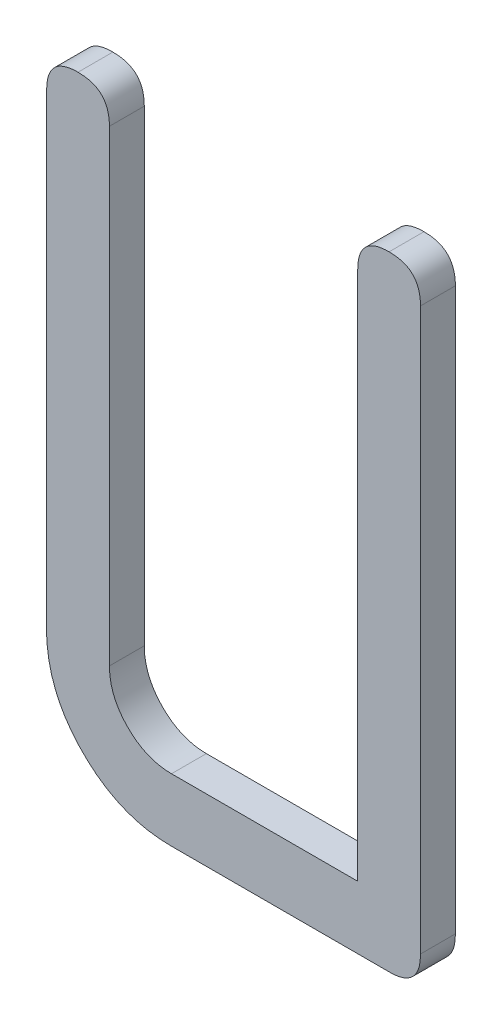
ISO-10303-21;
HEADER;
FILE_DESCRIPTION(('STEP AP214'),'2;1');
FILE_NAME('part.step','',(''),(''),'','','');
FILE_SCHEMA(('AUTOMOTIVE_DESIGN { 1 0 10303 214 1 1 1 1 }'));
ENDSEC;
DATA;
#1=APPLICATION_CONTEXT('core data for automotive mechanical design processes');
#2=APPLICATION_PROTOCOL_DEFINITION('international standard','automotive_design',2000,#1);
#3=PRODUCT_CONTEXT('',#1,'mechanical');
#4=PRODUCT('Part','Part','',(#3));
#5=PRODUCT_RELATED_PRODUCT_CATEGORY('part','',(#4));
#6=PRODUCT_DEFINITION_FORMATION('','',#4);
#7=PRODUCT_DEFINITION_CONTEXT('part definition',#1,'design');
#8=PRODUCT_DEFINITION('design','',#6,#7);
#9=PRODUCT_DEFINITION_SHAPE('','',#8);
#10=(LENGTH_UNIT() NAMED_UNIT(*) SI_UNIT(.MILLI.,.METRE.));
#11=(NAMED_UNIT(*) PLANE_ANGLE_UNIT() SI_UNIT($,.RADIAN.));
#12=(NAMED_UNIT(*) SI_UNIT($,.STERADIAN.) SOLID_ANGLE_UNIT());
#13=UNCERTAINTY_MEASURE_WITH_UNIT(LENGTH_MEASURE(1.E-05),#10,'distance_accuracy_value','');
#14=(GEOMETRIC_REPRESENTATION_CONTEXT(3) GLOBAL_UNCERTAINTY_ASSIGNED_CONTEXT((#13)) GLOBAL_UNIT_ASSIGNED_CONTEXT((#10,
#11,#12)) REPRESENTATION_CONTEXT('',''));
#15=CARTESIAN_POINT('',(0.,0.,0.));
#16=DIRECTION('',(0.,0.,1.));
#17=DIRECTION('',(1.,0.,0.));
#18=AXIS2_PLACEMENT_3D('',#15,#16,#17);
#19=CARTESIAN_POINT('',(0.,0.,1.6));
#20=DIRECTION('',(0.,0.,-1.));
#21=DIRECTION('',(-1.,0.,0.));
#22=AXIS2_PLACEMENT_3D('',#19,#20,#21);
#23=PLANE('',#22);
#24=CARTESIAN_POINT('',(5.0490562474728,-20.3746172798276,1.6));
#25=CARTESIAN_POINT('',(5.0490562474728,-20.2853047798276,1.6));
#26=CARTESIAN_POINT('',(5.1390562474728,-20.2853047798276,1.6));
#27=B_SPLINE_CURVE_WITH_KNOTS('',2,(#24,#25,#26),.UNSPECIFIED.,.F.,.F.,(3,3),(0.,1.),.UNSPECIFIED.);
#28=CARTESIAN_POINT('',(5.0490562474728,-20.3746172798276,1.6));
#29=VERTEX_POINT('',#28);
#30=CARTESIAN_POINT('',(5.1390562474728,-20.2853047798276,1.6));
#31=VERTEX_POINT('',#30);
#32=EDGE_CURVE('E167',#29,#31,#27,.T.);
#33=ORIENTED_EDGE('',*,*,#32,.T.);
#34=CARTESIAN_POINT('',(5.1390562474728,-20.2853047798276,1.6));
#35=CARTESIAN_POINT('',(5.2290562474728,-20.2853047798276,1.6));
#36=CARTESIAN_POINT('',(5.2290562474728,-20.3746797798276,1.6));
#37=B_SPLINE_CURVE_WITH_KNOTS('',2,(#34,#35,#36),.UNSPECIFIED.,.F.,.F.,(3,3),(0.,1.),.UNSPECIFIED.);
#38=CARTESIAN_POINT('',(5.2290562474728,-20.3746797798276,1.6));
#39=VERTEX_POINT('',#38);
#40=EDGE_CURVE('E131',#31,#39,#37,.T.);
#41=ORIENTED_EDGE('',*,*,#40,.T.);
#42=DIRECTION('',(0.,1.,0.));
#43=VECTOR('',#42,1.);
#44=CARTESIAN_POINT('',(5.2290562474728,-20.3746797798276,1.6));
#45=LINE('',#44,#43);
#46=CARTESIAN_POINT('',(5.2290562474728,-21.9839297798276,1.6));
#47=VERTEX_POINT('',#46);
#48=EDGE_CURVE('E126',#47,#39,#45,.T.);
#49=ORIENTED_EDGE('',*,*,#48,.F.);
#50=CARTESIAN_POINT('',(5.2290562474728,-21.9839297798276,1.6));
#51=CARTESIAN_POINT('',(5.2290562474728,-22.0733047798276,1.6));
#52=CARTESIAN_POINT('',(5.1397437474728,-22.0733047798276,1.6));
#53=B_SPLINE_CURVE_WITH_KNOTS('',2,(#50,#51,#52),.UNSPECIFIED.,.F.,.F.,(3,3),(0.,1.),.UNSPECIFIED.);
#54=CARTESIAN_POINT('',(5.1397437474728,-22.0733047798276,1.6));
#55=VERTEX_POINT('',#54);
#56=EDGE_CURVE('E115',#47,#55,#53,.T.);
#57=ORIENTED_EDGE('',*,*,#56,.T.);
#58=DIRECTION('',(1.,0.,0.));
#59=VECTOR('',#58,1.);
#60=CARTESIAN_POINT('',(5.1397437474728,-22.0733047798276,1.6));
#61=LINE('',#60,#59);
#62=CARTESIAN_POINT('',(4.5143687474728,-22.0733047798276,1.6));
#63=VERTEX_POINT('',#62);
#64=EDGE_CURVE('E123',#63,#55,#61,.T.);
#65=ORIENTED_EDGE('',*,*,#64,.F.);
#66=CARTESIAN_POINT('',(4.5143687474728,-22.0733047798276,1.6));
#67=CARTESIAN_POINT('',(4.50393603895574,-22.073304754124,1.6));
#68=CARTESIAN_POINT('',(4.49350386209723,-22.0729154749746,1.6));
#69=CARTESIAN_POINT('',(4.472695054846,-22.0712921820855,1.6));
#70=CARTESIAN_POINT('',(4.46231849664316,-22.070057256145,1.6));
#71=CARTESIAN_POINT('',(4.43155614728114,-22.0650131629388,1.6));
#72=CARTESIAN_POINT('',(4.41136532856191,-22.0598667097274,1.6));
#73=CARTESIAN_POINT('',(4.37258794329084,-22.0459610773158,1.6));
#74=CARTESIAN_POINT('',(4.35398314812924,-22.0372525012637,1.6));
#75=CARTESIAN_POINT('',(4.31863280545991,-22.0165900034179,1.6));
#76=CARTESIAN_POINT('',(4.30189080265436,-22.0046300385335,1.6));
#77=CARTESIAN_POINT('',(4.27889005754236,-21.985203781461,1.6));
#78=CARTESIAN_POINT('',(4.27177587829491,-21.9787129878903,1.6));
#79=CARTESIAN_POINT('',(4.25801399862505,-21.9652541426843,1.6));
#80=CARTESIAN_POINT('',(4.25136629036991,-21.9582860990667,1.6));
#81=CARTESIAN_POINT('',(4.23223778448844,-21.9366846074464,1.6));
#82=CARTESIAN_POINT('',(4.22054540978263,-21.9213318030311,1.6));
#83=CARTESIAN_POINT('',(4.19863866809116,-21.8868927684254,1.6));
#84=CARTESIAN_POINT('',(4.18877631776532,-21.8675795690674,1.6));
#85=CARTESIAN_POINT('',(4.17303460967354,-21.8273811732028,1.6));
#86=CARTESIAN_POINT('',(4.16715638416496,-21.8064955316924,1.6));
#87=CARTESIAN_POINT('',(4.16111567985639,-21.7737918216992,1.6));
#88=CARTESIAN_POINT('',(4.15956832774919,-21.7622049599132,1.6));
#89=CARTESIAN_POINT('',(4.15753973602336,-21.7389712730455,1.6));
#90=CARTESIAN_POINT('',(4.15705536680045,-21.7273247254521,1.6));
#91=CARTESIAN_POINT('',(4.1570562474728,-21.7156797798276,1.6));
#92=B_SPLINE_CURVE_WITH_KNOTS('',3,(#66,#67,#68,#69,#70,#71,#72,#73,#74,#75,#76,#77,#78,#79,#80,
#81,#82,#83,#84,#85,#86,#87,#88,#89,#90,#91),.UNSPECIFIED.,.F.,.F.,(4,2,2,2,2,2,2,2,2,2,2,2,4),
(0.,0.0312867126848692,0.062607227678475,0.124737780063914,0.186014779363176,0.247406457190195,
0.276278624651331,0.305150307190951,0.362792001355015,0.427434931974207,0.492096225918407,
0.527122745388371,0.562046001633574),.UNSPECIFIED.);
#93=CARTESIAN_POINT('',(4.1570562474728,-21.7156797798276,1.6));
#94=VERTEX_POINT('',#93);
#95=EDGE_CURVE('E23',#63,#94,#92,.T.);
#96=ORIENTED_EDGE('',*,*,#95,.T.);
#97=DIRECTION('',(0.,1.,0.));
#98=VECTOR('',#97,1.);
#99=CARTESIAN_POINT('',(4.1570562474728,-21.7156797798276,1.6));
#100=LINE('',#99,#98);
#101=CARTESIAN_POINT('',(4.1570562474728,-20.3746797798276,1.6));
#102=VERTEX_POINT('',#101);
#103=EDGE_CURVE('E289',#102,#94,#100,.F.);
#104=ORIENTED_EDGE('',*,*,#103,.F.);
#105=CARTESIAN_POINT('',(4.1570562474728,-20.3746797798276,1.6));
#106=CARTESIAN_POINT('',(4.1570562474728,-20.2853047798276,1.6));
#107=CARTESIAN_POINT('',(4.2470562474728,-20.2853047798276,1.6));
#108=B_SPLINE_CURVE_WITH_KNOTS('',2,(#105,#106,#107),.UNSPECIFIED.,.F.,.F.,(3,3),(0.,1.),.UNSPECIFIED.);
#109=CARTESIAN_POINT('',(4.2470562474728,-20.2853047798276,1.6));
#110=VERTEX_POINT('',#109);
#111=EDGE_CURVE('E140',#102,#110,#108,.T.);
#112=ORIENTED_EDGE('',*,*,#111,.T.);
#113=CARTESIAN_POINT('',(4.2470562474728,-20.2853047798276,1.6));
#114=CARTESIAN_POINT('',(4.3370562474728,-20.2853047798276,1.6));
#115=CARTESIAN_POINT('',(4.3370562474728,-20.3746172798276,1.6));
#116=B_SPLINE_CURVE_WITH_KNOTS('',2,(#113,#114,#115),.UNSPECIFIED.,.F.,.F.,(3,3),(0.,1.),.UNSPECIFIED.);
#117=CARTESIAN_POINT('',(4.3370562474728,-20.3746172798276,1.6));
#118=VERTEX_POINT('',#117);
#119=EDGE_CURVE('E165',#110,#118,#116,.T.);
#120=ORIENTED_EDGE('',*,*,#119,.T.);
#121=DIRECTION('',(0.,1.,0.));
#122=VECTOR('',#121,1.);
#123=CARTESIAN_POINT('',(4.3370562474728,-20.3746172798276,1.6));
#124=LINE('',#123,#122);
#125=CARTESIAN_POINT('',(4.3370562474728,-21.7146172798276,1.6));
#126=VERTEX_POINT('',#125);
#127=EDGE_CURVE('E281',#126,#118,#124,.T.);
#128=ORIENTED_EDGE('',*,*,#127,.F.);
#129=CARTESIAN_POINT('',(4.3370562474728,-21.7146172798276,1.6));
#130=CARTESIAN_POINT('',(4.33704374375032,-21.7230571255512,1.6));
#131=CARTESIAN_POINT('',(4.3375783012639,-21.7315111779369,1.6));
#132=CARTESIAN_POINT('',(4.33981596617988,-21.7482397337702,1.6));
#133=CARTESIAN_POINT('',(4.34151621745391,-21.756514625184,1.6));
#134=CARTESIAN_POINT('',(4.34665663870329,-21.7744573287166,1.6));
#135=CARTESIAN_POINT('',(4.3503917142759,-21.7840433588827,1.6));
#136=CARTESIAN_POINT('',(4.35956572059307,-21.8023666239929,1.6));
#137=CARTESIAN_POINT('',(4.36500657707079,-21.8111028849159,1.6));
#138=CARTESIAN_POINT('',(4.37680816243496,-21.8269306761822,1.6));
#139=CARTESIAN_POINT('',(4.38307222513936,-21.8340958276667,1.6));
#140=CARTESIAN_POINT('',(4.39649605824151,-21.8475332293022,1.6));
#141=CARTESIAN_POINT('',(4.40365602035466,-21.8538052877224,1.6));
#142=CARTESIAN_POINT('',(4.42022465453052,-21.8661659979595,1.6));
#143=CARTESIAN_POINT('',(4.42980728590008,-21.8720278527775,1.6));
#144=CARTESIAN_POINT('',(4.44996405310579,-21.8816704557201,1.6));
#145=CARTESIAN_POINT('',(4.46053695087667,-21.8854537629161,1.6));
#146=CARTESIAN_POINT('',(4.4785021736995,-21.8899098976345,1.6));
#147=CARTESIAN_POINT('',(4.48574940480107,-21.89120350382,1.6));
#148=CARTESIAN_POINT('',(4.50035195843826,-21.8929036998722,1.6));
#149=CARTESIAN_POINT('',(4.50770732640855,-21.893309905507,1.6));
#150=CARTESIAN_POINT('',(4.5150562474728,-21.8933047798276,1.6));
#151=B_SPLINE_CURVE_WITH_KNOTS('',3,(#129,#130,#131,#132,#133,#134,#135,#136,#137,#138,#139,
#140,#141,#142,#143,#144,#145,#146,#147,#148,#149,#150),.UNSPECIFIED.,.F.,.F.,(4,2,2,2,2,2,2,2,
2,2,4),(0.,0.0253217096994885,0.0505815980153853,0.0812577834004923,0.11196872598776,
0.140428441846121,0.168894258308297,0.202372845262285,0.23581012106628,0.257843277302252,
0.279885971697863),.UNSPECIFIED.);
#152=CARTESIAN_POINT('',(4.5150562474728,-21.8933047798276,1.6));
#153=VERTEX_POINT('',#152);
#154=EDGE_CURVE('E169',#126,#153,#151,.T.);
#155=ORIENTED_EDGE('',*,*,#154,.T.);
#156=DIRECTION('',(1.,0.,0.));
#157=VECTOR('',#156,1.);
#158=CARTESIAN_POINT('',(4.5150562474728,-21.8933047798276,1.6));
#159=LINE('',#158,#157);
#160=CARTESIAN_POINT('',(5.0490562474728,-21.8933047798276,1.6));
#161=VERTEX_POINT('',#160);
#162=EDGE_CURVE('E176',#161,#153,#159,.F.);
#163=ORIENTED_EDGE('',*,*,#162,.F.);
#164=DIRECTION('',(0.,1.,0.));
#165=VECTOR('',#164,1.);
#166=CARTESIAN_POINT('',(5.0490562474728,-21.8933047798276,1.6));
#167=LINE('',#166,#165);
#168=EDGE_CURVE('E272',#29,#161,#167,.F.);
#169=ORIENTED_EDGE('',*,*,#168,.F.);
#170=EDGE_LOOP('',(#33,#41,#49,#57,#65,#96,#104,#112,#120,#128,#155,#163,#169));
#171=FACE_BOUND('',#170,.T.);
#172=ADVANCED_FACE('F17',(#171),#23,.T.);
#173=CARTESIAN_POINT('',(5.2290562474728,-21.9839297798276,1.7));
#174=CARTESIAN_POINT('',(5.2290562474728,-22.0733047798276,1.7));
#175=CARTESIAN_POINT('',(5.1397437474728,-22.0733047798276,1.7));
#176=CARTESIAN_POINT('',(5.2290562474728,-21.9839297798276,1.6));
#177=CARTESIAN_POINT('',(5.2290562474728,-22.0733047798276,1.6));
#178=CARTESIAN_POINT('',(5.1397437474728,-22.0733047798276,1.6));
#179=B_SPLINE_SURFACE_WITH_KNOTS('',1,2,((#173,#174,#175),(#176,#177,#178)),.UNSPECIFIED.,.F.,
.F.,.F.,(2,2),(3,3),(0.,1.),(0.,1.),.UNSPECIFIED.);
#180=DIRECTION('',(0.,0.,-1.));
#181=VECTOR('',#180,1.);
#182=CARTESIAN_POINT('',(5.2290562474728,-21.9839297798276,1.7));
#183=LINE('',#182,#181);
#184=CARTESIAN_POINT('',(5.2290562474728,-21.9839297798276,1.7));
#185=VERTEX_POINT('',#184);
#186=EDGE_CURVE('E119',#185,#47,#183,.T.);
#187=CARTESIAN_POINT('',(5.2290562474728,-21.9839297798276,1.7));
#188=CARTESIAN_POINT('',(5.2290562474728,-22.0733047798276,1.7));
#189=CARTESIAN_POINT('',(5.1397437474728,-22.0733047798276,1.7));
#190=B_SPLINE_CURVE_WITH_KNOTS('',2,(#187,#188,#189),.UNSPECIFIED.,.F.,.F.,(3,3),(0.,1.),.UNSPECIFIED.);
#191=CARTESIAN_POINT('',(5.1397437474728,-22.0733047798276,1.7));
#192=VERTEX_POINT('',#191);
#193=EDGE_CURVE('E128',#185,#192,#190,.T.);
#194=DIRECTION('',(0.,0.,-1.));
#195=VECTOR('',#194,1.);
#196=CARTESIAN_POINT('',(5.1397437474728,-22.0733047798276,1.7));
#197=LINE('',#196,#195);
#198=EDGE_CURVE('E120',#55,#192,#197,.F.);
#199=ORIENTED_EDGE('',*,*,#186,.F.);
#200=ORIENTED_EDGE('',*,*,#193,.T.);
#201=ORIENTED_EDGE('',*,*,#198,.F.);
#202=ORIENTED_EDGE('',*,*,#56,.F.);
#203=EDGE_LOOP('',(#199,#200,#201,#202));
#204=FACE_BOUND('',#203,.T.);
#205=ADVANCED_FACE('F117',(#204),#179,.F.);
#206=CARTESIAN_POINT('',(5.1397437474728,-22.0733047798276,1.7));
#207=DIRECTION('',(0.,-1.,0.));
#208=DIRECTION('',(0.,0.,-1.));
#209=AXIS2_PLACEMENT_3D('',#206,#207,#208);
#210=PLANE('',#209);
#211=DIRECTION('',(-1.,0.,0.));
#212=VECTOR('',#211,1.);
#213=CARTESIAN_POINT('',(0.,-22.0733047798276,1.7));
#214=LINE('',#213,#212);
#215=CARTESIAN_POINT('',(4.5143687474728,-22.0733047798276,1.7));
#216=VERTEX_POINT('',#215);
#217=EDGE_CURVE('E261',#192,#216,#214,.T.);
#218=ORIENTED_EDGE('',*,*,#217,.T.);
#219=DIRECTION('',(0.,0.,-1.));
#220=VECTOR('',#219,1.);
#221=CARTESIAN_POINT('',(4.5143687474728,-22.0733047798276,1.65));
#222=LINE('',#221,#220);
#223=EDGE_CURVE('E290',#216,#63,#222,.T.);
#224=ORIENTED_EDGE('',*,*,#223,.T.);
#225=ORIENTED_EDGE('',*,*,#64,.T.);
#226=ORIENTED_EDGE('',*,*,#198,.T.);
#227=EDGE_LOOP('',(#218,#224,#225,#226));
#228=FACE_BOUND('',#227,.T.);
#229=ADVANCED_FACE('F152',(#228),#210,.T.);
#230=CARTESIAN_POINT('',(4.5143687474728,-22.0733047798276,1.7));
#231=CARTESIAN_POINT('',(4.3661187474728,-22.0733047798276,1.7));
#232=CARTESIAN_POINT('',(4.1570562474728,-21.8641172798276,1.7));
#233=CARTESIAN_POINT('',(4.1570562474728,-21.7156797798276,1.7));
#234=CARTESIAN_POINT('',(4.5143687474728,-22.0733047798276,1.6));
#235=CARTESIAN_POINT('',(4.3661187474728,-22.0733047798276,1.6));
#236=CARTESIAN_POINT('',(4.1570562474728,-21.8641172798276,1.6));
#237=CARTESIAN_POINT('',(4.1570562474728,-21.7156797798276,1.6));
#238=B_SPLINE_SURFACE_WITH_KNOTS('',1,2,((#230,#231,#232,#233),(#234,#235,#236,#237)),
.UNSPECIFIED.,.F.,.F.,.F.,(2,2),(3,1,3),(0.,1.),(0.,0.5,1.),.UNSPECIFIED.);
#239=CARTESIAN_POINT('',(4.5143687474728,-22.0733047798276,1.7));
#240=CARTESIAN_POINT('',(4.50393603895574,-22.073304754124,1.7));
#241=CARTESIAN_POINT('',(4.49350386209723,-22.0729154749746,1.7));
#242=CARTESIAN_POINT('',(4.472695054846,-22.0712921820855,1.7));
#243=CARTESIAN_POINT('',(4.46231849664316,-22.070057256145,1.7));
#244=CARTESIAN_POINT('',(4.43155614728115,-22.0650131629388,1.7));
#245=CARTESIAN_POINT('',(4.41136532856191,-22.0598667097274,1.7));
#246=CARTESIAN_POINT('',(4.37258794329084,-22.0459610773158,1.7));
#247=CARTESIAN_POINT('',(4.35398314812924,-22.0372525012637,1.7));
#248=CARTESIAN_POINT('',(4.31863280545991,-22.0165900034179,1.7));
#249=CARTESIAN_POINT('',(4.30189080265435,-22.0046300385335,1.7));
#250=CARTESIAN_POINT('',(4.27889005754236,-21.985203781461,1.7));
#251=CARTESIAN_POINT('',(4.27177587829492,-21.9787129878903,1.7));
#252=CARTESIAN_POINT('',(4.25801399862506,-21.9652541426843,1.7));
#253=CARTESIAN_POINT('',(4.25136629036991,-21.9582860990667,1.7));
#254=CARTESIAN_POINT('',(4.23223778448844,-21.9366846074464,1.7));
#255=CARTESIAN_POINT('',(4.22054540978263,-21.9213318030311,1.7));
#256=CARTESIAN_POINT('',(4.19863866809116,-21.8868927684254,1.7));
#257=CARTESIAN_POINT('',(4.18877631776533,-21.8675795690674,1.7));
#258=CARTESIAN_POINT('',(4.17303460967355,-21.8273811732028,1.7));
#259=CARTESIAN_POINT('',(4.16715638416497,-21.8064955316925,1.7));
#260=CARTESIAN_POINT('',(4.16111567985639,-21.7737918216992,1.7));
#261=CARTESIAN_POINT('',(4.15956832774919,-21.7622049599132,1.7));
#262=CARTESIAN_POINT('',(4.15753973602336,-21.7389712730456,1.7));
#263=CARTESIAN_POINT('',(4.15705536680044,-21.7273247254521,1.7));
#264=CARTESIAN_POINT('',(4.1570562474728,-21.7156797798276,1.7));
#265=B_SPLINE_CURVE_WITH_KNOTS('',3,(#239,#240,#241,#242,#243,#244,#245,#246,#247,#248,#249,
#250,#251,#252,#253,#254,#255,#256,#257,#258,#259,#260,#261,#262,#263,#264),.UNSPECIFIED.,.F.,
.F.,(4,2,2,2,2,2,2,2,2,2,2,2,4),(0.,0.03128671268487,0.0626072276784754,0.124737780063913,
0.186014779363175,0.247406457190193,0.276278624651331,0.305150307190952,0.362792001355012,
0.427434931974199,0.492096225918396,0.527122745388367,0.562046001633573),.UNSPECIFIED.);
#266=CARTESIAN_POINT('',(4.1570562474728,-21.7156797798276,1.7));
#267=VERTEX_POINT('',#266);
#268=EDGE_CURVE('E178',#216,#267,#265,.T.);
#269=DIRECTION('',(0.,0.,1.));
#270=VECTOR('',#269,1.);
#271=CARTESIAN_POINT('',(4.1570562474728,-21.7156797798276,1.7));
#272=LINE('',#271,#270);
#273=EDGE_CURVE('E288',#94,#267,#272,.T.);
#274=ORIENTED_EDGE('',*,*,#223,.F.);
#275=ORIENTED_EDGE('',*,*,#268,.T.);
#276=ORIENTED_EDGE('',*,*,#273,.F.);
#277=ORIENTED_EDGE('',*,*,#95,.F.);
#278=EDGE_LOOP('',(#274,#275,#276,#277));
#279=FACE_BOUND('',#278,.T.);
#280=ADVANCED_FACE('F299',(#279),#238,.F.);
#281=CARTESIAN_POINT('',(4.1570562474728,-21.7156797798276,1.7));
#282=DIRECTION('',(-1.,0.,0.));
#283=DIRECTION('',(0.,0.,1.));
#284=AXIS2_PLACEMENT_3D('',#281,#282,#283);
#285=PLANE('',#284);
#286=DIRECTION('',(0.,1.,0.));
#287=VECTOR('',#286,1.);
#288=CARTESIAN_POINT('',(4.1570562474728,0.,1.7));
#289=LINE('',#288,#287);
#290=CARTESIAN_POINT('',(4.1570562474728,-20.3746797798276,1.7));
#291=VERTEX_POINT('',#290);
#292=EDGE_CURVE('E258',#267,#291,#289,.T.);
#293=ORIENTED_EDGE('',*,*,#292,.T.);
#294=DIRECTION('',(0.,0.,-1.));
#295=VECTOR('',#294,1.);
#296=CARTESIAN_POINT('',(4.1570562474728,-20.3746797798276,1.65));
#297=LINE('',#296,#295);
#298=EDGE_CURVE('E285',#291,#102,#297,.T.);
#299=ORIENTED_EDGE('',*,*,#298,.T.);
#300=ORIENTED_EDGE('',*,*,#103,.T.);
#301=ORIENTED_EDGE('',*,*,#273,.T.);
#302=EDGE_LOOP('',(#293,#299,#300,#301));
#303=FACE_BOUND('',#302,.T.);
#304=ADVANCED_FACE('F304',(#303),#285,.T.);
#305=CARTESIAN_POINT('',(4.1570562474728,-20.3746797798276,1.7));
#306=CARTESIAN_POINT('',(4.1570562474728,-20.2853047798276,1.7));
#307=CARTESIAN_POINT('',(4.2470562474728,-20.2853047798276,1.7));
#308=CARTESIAN_POINT('',(4.1570562474728,-20.3746797798276,1.6));
#309=CARTESIAN_POINT('',(4.1570562474728,-20.2853047798276,1.6));
#310=CARTESIAN_POINT('',(4.2470562474728,-20.2853047798276,1.6));
#311=B_SPLINE_SURFACE_WITH_KNOTS('',1,2,((#305,#306,#307),(#308,#309,#310)),.UNSPECIFIED.,.F.,
.F.,.F.,(2,2),(3,3),(0.,1.),(0.,1.),.UNSPECIFIED.);
#312=CARTESIAN_POINT('',(4.1570562474728,-20.3746797798276,1.7));
#313=CARTESIAN_POINT('',(4.1570562474728,-20.2853047798276,1.7));
#314=CARTESIAN_POINT('',(4.2470562474728,-20.2853047798276,1.7));
#315=B_SPLINE_CURVE_WITH_KNOTS('',2,(#312,#313,#314),.UNSPECIFIED.,.F.,.F.,(3,3),(0.,1.),.UNSPECIFIED.);
#316=CARTESIAN_POINT('',(4.2470562474728,-20.2853047798276,1.7));
#317=VERTEX_POINT('',#316);
#318=EDGE_CURVE('E228',#291,#317,#315,.T.);
#319=DIRECTION('',(0.,0.,-1.));
#320=VECTOR('',#319,1.);
#321=CARTESIAN_POINT('',(4.2470562474728,-20.2853047798276,1.65));
#322=LINE('',#321,#320);
#323=EDGE_CURVE('E282',#317,#110,#322,.T.);
#324=ORIENTED_EDGE('',*,*,#298,.F.);
#325=ORIENTED_EDGE('',*,*,#318,.T.);
#326=ORIENTED_EDGE('',*,*,#323,.T.);
#327=ORIENTED_EDGE('',*,*,#111,.F.);
#328=EDGE_LOOP('',(#324,#325,#326,#327));
#329=FACE_BOUND('',#328,.T.);
#330=ADVANCED_FACE('F317',(#329),#311,.F.);
#331=CARTESIAN_POINT('',(4.2470562474728,-20.2853047798276,1.7));
#332=CARTESIAN_POINT('',(4.3370562474728,-20.2853047798276,1.7));
#333=CARTESIAN_POINT('',(4.3370562474728,-20.3746172798276,1.7));
#334=CARTESIAN_POINT('',(4.2470562474728,-20.2853047798276,1.6));
#335=CARTESIAN_POINT('',(4.3370562474728,-20.2853047798276,1.6));
#336=CARTESIAN_POINT('',(4.3370562474728,-20.3746172798276,1.6));
#337=B_SPLINE_SURFACE_WITH_KNOTS('',1,2,((#331,#332,#333),(#334,#335,#336)),.UNSPECIFIED.,.F.,
.F.,.F.,(2,2),(3,3),(0.,1.),(0.,1.),.UNSPECIFIED.);
#338=CARTESIAN_POINT('',(4.2470562474728,-20.2853047798276,1.7));
#339=CARTESIAN_POINT('',(4.3370562474728,-20.2853047798276,1.7));
#340=CARTESIAN_POINT('',(4.3370562474728,-20.3746172798276,1.7));
#341=B_SPLINE_CURVE_WITH_KNOTS('',2,(#338,#339,#340),.UNSPECIFIED.,.F.,.F.,(3,3),(0.,1.),.UNSPECIFIED.);
#342=CARTESIAN_POINT('',(4.3370562474728,-20.3746172798276,1.7));
#343=VERTEX_POINT('',#342);
#344=EDGE_CURVE('E232',#317,#343,#341,.T.);
#345=DIRECTION('',(0.,0.,-1.));
#346=VECTOR('',#345,1.);
#347=CARTESIAN_POINT('',(4.3370562474728,-20.3746172798276,1.7));
#348=LINE('',#347,#346);
#349=EDGE_CURVE('E279',#118,#343,#348,.F.);
#350=ORIENTED_EDGE('',*,*,#323,.F.);
#351=ORIENTED_EDGE('',*,*,#344,.T.);
#352=ORIENTED_EDGE('',*,*,#349,.F.);
#353=ORIENTED_EDGE('',*,*,#119,.F.);
#354=EDGE_LOOP('',(#350,#351,#352,#353));
#355=FACE_BOUND('',#354,.T.);
#356=ADVANCED_FACE('F193',(#355),#337,.F.);
#357=CARTESIAN_POINT('',(4.3370562474728,-20.3746172798276,1.7));
#358=DIRECTION('',(1.,0.,0.));
#359=DIRECTION('',(0.,0.,-1.));
#360=AXIS2_PLACEMENT_3D('',#357,#358,#359);
#361=PLANE('',#360);
#362=DIRECTION('',(0.,1.,0.));
#363=VECTOR('',#362,1.);
#364=CARTESIAN_POINT('',(4.3370562474728,0.,1.7));
#365=LINE('',#364,#363);
#366=CARTESIAN_POINT('',(4.3370562474728,-21.7146172798276,1.7));
#367=VERTEX_POINT('',#366);
#368=EDGE_CURVE('E213',#343,#367,#365,.F.);
#369=ORIENTED_EDGE('',*,*,#368,.T.);
#370=DIRECTION('',(0.,0.,-1.));
#371=VECTOR('',#370,1.);
#372=CARTESIAN_POINT('',(4.3370562474728,-21.7146172798276,1.65));
#373=LINE('',#372,#371);
#374=EDGE_CURVE('E177',#367,#126,#373,.T.);
#375=ORIENTED_EDGE('',*,*,#374,.T.);
#376=ORIENTED_EDGE('',*,*,#127,.T.);
#377=ORIENTED_EDGE('',*,*,#349,.T.);
#378=EDGE_LOOP('',(#369,#375,#376,#377));
#379=FACE_BOUND('',#378,.T.);
#380=ADVANCED_FACE('F191',(#379),#361,.T.);
#381=CARTESIAN_POINT('',(4.3370562474728,-21.7146172798276,1.7));
#382=CARTESIAN_POINT('',(4.3370562474728,-21.7878672798276,1.7));
#383=CARTESIAN_POINT('',(4.4420562474728,-21.8933047798276,1.7));
#384=CARTESIAN_POINT('',(4.5150562474728,-21.8933047798276,1.7));
#385=CARTESIAN_POINT('',(4.3370562474728,-21.7146172798276,1.6));
#386=CARTESIAN_POINT('',(4.3370562474728,-21.7878672798276,1.6));
#387=CARTESIAN_POINT('',(4.4420562474728,-21.8933047798276,1.6));
#388=CARTESIAN_POINT('',(4.5150562474728,-21.8933047798276,1.6));
#389=B_SPLINE_SURFACE_WITH_KNOTS('',1,2,((#381,#382,#383,#384),(#385,#386,#387,#388)),
.UNSPECIFIED.,.F.,.F.,.F.,(2,2),(3,1,3),(0.,1.),(0.,0.5,1.),.UNSPECIFIED.);
#390=CARTESIAN_POINT('',(4.3370562474728,-21.7146172798276,1.7));
#391=CARTESIAN_POINT('',(4.33704374375032,-21.7230571255512,1.7));
#392=CARTESIAN_POINT('',(4.3375783012639,-21.7315111779369,1.7));
#393=CARTESIAN_POINT('',(4.33981596617988,-21.7482397337702,1.7));
#394=CARTESIAN_POINT('',(4.34151621745391,-21.756514625184,1.7));
#395=CARTESIAN_POINT('',(4.3466566387033,-21.7744573287166,1.7));
#396=CARTESIAN_POINT('',(4.35039171427591,-21.7840433588827,1.7));
#397=CARTESIAN_POINT('',(4.35956572059308,-21.8023666239929,1.7));
#398=CARTESIAN_POINT('',(4.36500657707079,-21.8111028849159,1.7));
#399=CARTESIAN_POINT('',(4.37680816243496,-21.8269306761822,1.7));
#400=CARTESIAN_POINT('',(4.38307222513936,-21.8340958276667,1.7));
#401=CARTESIAN_POINT('',(4.39649605824151,-21.8475332293022,1.7));
#402=CARTESIAN_POINT('',(4.40365602035466,-21.8538052877224,1.7));
#403=CARTESIAN_POINT('',(4.42022465453053,-21.8661659979595,1.7));
#404=CARTESIAN_POINT('',(4.42980728590008,-21.8720278527775,1.7));
#405=CARTESIAN_POINT('',(4.44996405310579,-21.8816704557201,1.7));
#406=CARTESIAN_POINT('',(4.46053695087667,-21.8854537629161,1.7));
#407=CARTESIAN_POINT('',(4.4785021736995,-21.8899098976345,1.7));
#408=CARTESIAN_POINT('',(4.48574940480107,-21.89120350382,1.7));
#409=CARTESIAN_POINT('',(4.50035195843827,-21.8929036998722,1.7));
#410=CARTESIAN_POINT('',(4.50770732640855,-21.893309905507,1.7));
#411=CARTESIAN_POINT('',(4.5150562474728,-21.8933047798276,1.7));
#412=B_SPLINE_CURVE_WITH_KNOTS('',3,(#390,#391,#392,#393,#394,#395,#396,#397,#398,#399,#400,
#401,#402,#403,#404,#405,#406,#407,#408,#409,#410,#411),.UNSPECIFIED.,.F.,.F.,(4,2,2,2,2,2,2,2,
2,2,4),(0.,0.0253217096994884,0.0505815980153854,0.0812577834004902,0.11196872598776,
0.140428441846121,0.168894258308297,0.202372845262287,0.23581012106628,0.257843277302252,
0.279885971697862),.UNSPECIFIED.);
#413=CARTESIAN_POINT('',(4.5150562474728,-21.8933047798276,1.7));
#414=VERTEX_POINT('',#413);
#415=EDGE_CURVE('E206',#367,#414,#412,.T.);
#416=DIRECTION('',(0.,0.,1.));
#417=VECTOR('',#416,1.);
#418=CARTESIAN_POINT('',(4.5150562474728,-21.8933047798276,1.7));
#419=LINE('',#418,#417);
#420=EDGE_CURVE('E275',#153,#414,#419,.T.);
#421=ORIENTED_EDGE('',*,*,#374,.F.);
#422=ORIENTED_EDGE('',*,*,#415,.T.);
#423=ORIENTED_EDGE('',*,*,#420,.F.);
#424=ORIENTED_EDGE('',*,*,#154,.F.);
#425=EDGE_LOOP('',(#421,#422,#423,#424));
#426=FACE_BOUND('',#425,.T.);
#427=ADVANCED_FACE('F184',(#426),#389,.F.);
#428=CARTESIAN_POINT('',(4.5150562474728,-21.8933047798276,1.7));
#429=DIRECTION('',(0.,1.,0.));
#430=DIRECTION('',(0.,0.,1.));
#431=AXIS2_PLACEMENT_3D('',#428,#429,#430);
#432=PLANE('',#431);
#433=DIRECTION('',(-1.,0.,0.));
#434=VECTOR('',#433,1.);
#435=CARTESIAN_POINT('',(0.,-21.8933047798276,1.7));
#436=LINE('',#435,#434);
#437=CARTESIAN_POINT('',(5.0490562474728,-21.8933047798276,1.7));
#438=VERTEX_POINT('',#437);
#439=EDGE_CURVE('E212',#414,#438,#436,.F.);
#440=ORIENTED_EDGE('',*,*,#439,.T.);
#441=DIRECTION('',(0.,0.,1.));
#442=VECTOR('',#441,1.);
#443=CARTESIAN_POINT('',(5.0490562474728,-21.8933047798276,1.7));
#444=LINE('',#443,#442);
#445=EDGE_CURVE('E269',#161,#438,#444,.T.);
#446=ORIENTED_EDGE('',*,*,#445,.F.);
#447=ORIENTED_EDGE('',*,*,#162,.T.);
#448=ORIENTED_EDGE('',*,*,#420,.T.);
#449=EDGE_LOOP('',(#440,#446,#447,#448));
#450=FACE_BOUND('',#449,.T.);
#451=ADVANCED_FACE('F190',(#450),#432,.T.);
#452=CARTESIAN_POINT('',(5.0490562474728,-21.8933047798276,1.7));
#453=DIRECTION('',(-1.,0.,0.));
#454=DIRECTION('',(0.,0.,1.));
#455=AXIS2_PLACEMENT_3D('',#452,#453,#454);
#456=PLANE('',#455);
#457=DIRECTION('',(0.,1.,0.));
#458=VECTOR('',#457,1.);
#459=CARTESIAN_POINT('',(5.0490562474728,0.,1.7));
#460=LINE('',#459,#458);
#461=CARTESIAN_POINT('',(5.0490562474728,-20.3746172798276,1.7));
#462=VERTEX_POINT('',#461);
#463=EDGE_CURVE('E247',#438,#462,#460,.T.);
#464=ORIENTED_EDGE('',*,*,#463,.T.);
#465=DIRECTION('',(0.,0.,-1.));
#466=VECTOR('',#465,1.);
#467=CARTESIAN_POINT('',(5.0490562474728,-20.3746172798276,1.65));
#468=LINE('',#467,#466);
#469=EDGE_CURVE('E266',#462,#29,#468,.T.);
#470=ORIENTED_EDGE('',*,*,#469,.T.);
#471=ORIENTED_EDGE('',*,*,#168,.T.);
#472=ORIENTED_EDGE('',*,*,#445,.T.);
#473=EDGE_LOOP('',(#464,#470,#471,#472));
#474=FACE_BOUND('',#473,.T.);
#475=ADVANCED_FACE('F327',(#474),#456,.T.);
#476=CARTESIAN_POINT('',(5.0490562474728,-20.3746172798276,1.7));
#477=CARTESIAN_POINT('',(5.0490562474728,-20.2853047798276,1.7));
#478=CARTESIAN_POINT('',(5.1390562474728,-20.2853047798276,1.7));
#479=CARTESIAN_POINT('',(5.0490562474728,-20.3746172798276,1.6));
#480=CARTESIAN_POINT('',(5.0490562474728,-20.2853047798276,1.6));
#481=CARTESIAN_POINT('',(5.1390562474728,-20.2853047798276,1.6));
#482=B_SPLINE_SURFACE_WITH_KNOTS('',1,2,((#476,#477,#478),(#479,#480,#481)),.UNSPECIFIED.,.F.,
.F.,.F.,(2,2),(3,3),(0.,1.),(0.,1.),.UNSPECIFIED.);
#483=CARTESIAN_POINT('',(5.0490562474728,-20.3746172798276,1.7));
#484=CARTESIAN_POINT('',(5.0490562474728,-20.2853047798276,1.7));
#485=CARTESIAN_POINT('',(5.1390562474728,-20.2853047798276,1.7));
#486=B_SPLINE_CURVE_WITH_KNOTS('',2,(#483,#484,#485),.UNSPECIFIED.,.F.,.F.,(3,3),(0.,1.),.UNSPECIFIED.);
#487=CARTESIAN_POINT('',(5.1390562474728,-20.2853047798276,1.7));
#488=VERTEX_POINT('',#487);
#489=EDGE_CURVE('E236',#462,#488,#486,.T.);
#490=DIRECTION('',(0.,0.,-1.));
#491=VECTOR('',#490,1.);
#492=CARTESIAN_POINT('',(5.1390562474728,-20.2853047798276,1.65));
#493=LINE('',#492,#491);
#494=EDGE_CURVE('E134',#488,#31,#493,.T.);
#495=ORIENTED_EDGE('',*,*,#469,.F.);
#496=ORIENTED_EDGE('',*,*,#489,.T.);
#497=ORIENTED_EDGE('',*,*,#494,.T.);
#498=ORIENTED_EDGE('',*,*,#32,.F.);
#499=EDGE_LOOP('',(#495,#496,#497,#498));
#500=FACE_BOUND('',#499,.T.);
#501=ADVANCED_FACE('F197',(#500),#482,.F.);
#502=CARTESIAN_POINT('',(5.1390562474728,-20.2853047798276,1.7));
#503=CARTESIAN_POINT('',(5.2290562474728,-20.2853047798276,1.7));
#504=CARTESIAN_POINT('',(5.2290562474728,-20.3746797798276,1.7));
#505=CARTESIAN_POINT('',(5.1390562474728,-20.2853047798276,1.6));
#506=CARTESIAN_POINT('',(5.2290562474728,-20.2853047798276,1.6));
#507=CARTESIAN_POINT('',(5.2290562474728,-20.3746797798276,1.6));
#508=B_SPLINE_SURFACE_WITH_KNOTS('',1,2,((#502,#503,#504),(#505,#506,#507)),.UNSPECIFIED.,.F.,
.F.,.F.,(2,2),(3,3),(0.,1.),(0.,1.),.UNSPECIFIED.);
#509=CARTESIAN_POINT('',(5.1390562474728,-20.2853047798276,1.7));
#510=CARTESIAN_POINT('',(5.2290562474728,-20.2853047798276,1.7));
#511=CARTESIAN_POINT('',(5.2290562474728,-20.3746797798276,1.7));
#512=B_SPLINE_CURVE_WITH_KNOTS('',2,(#509,#510,#511),.UNSPECIFIED.,.F.,.F.,(3,3),(0.,1.),.UNSPECIFIED.);
#513=CARTESIAN_POINT('',(5.2290562474728,-20.3746797798276,1.7));
#514=VERTEX_POINT('',#513);
#515=EDGE_CURVE('E34',#488,#514,#512,.T.);
#516=DIRECTION('',(0.,0.,-1.));
#517=VECTOR('',#516,1.);
#518=CARTESIAN_POINT('',(5.2290562474728,-20.3746797798276,1.7));
#519=LINE('',#518,#517);
#520=EDGE_CURVE('E42',#39,#514,#519,.F.);
#521=ORIENTED_EDGE('',*,*,#494,.F.);
#522=ORIENTED_EDGE('',*,*,#515,.T.);
#523=ORIENTED_EDGE('',*,*,#520,.F.);
#524=ORIENTED_EDGE('',*,*,#40,.F.);
#525=EDGE_LOOP('',(#521,#522,#523,#524));
#526=FACE_BOUND('',#525,.T.);
#527=ADVANCED_FACE('F19',(#526),#508,.F.);
#528=CARTESIAN_POINT('',(5.2290562474728,-20.3746797798276,1.7));
#529=DIRECTION('',(1.,0.,0.));
#530=DIRECTION('',(0.,0.,-1.));
#531=AXIS2_PLACEMENT_3D('',#528,#529,#530);
#532=PLANE('',#531);
#533=DIRECTION('',(0.,1.,0.));
#534=VECTOR('',#533,1.);
#535=CARTESIAN_POINT('',(5.2290562474728,0.,1.7));
#536=LINE('',#535,#534);
#537=EDGE_CURVE('E11',#514,#185,#536,.F.);
#538=ORIENTED_EDGE('',*,*,#537,.T.);
#539=ORIENTED_EDGE('',*,*,#186,.T.);
#540=ORIENTED_EDGE('',*,*,#48,.T.);
#541=ORIENTED_EDGE('',*,*,#520,.T.);
#542=EDGE_LOOP('',(#538,#539,#540,#541));
#543=FACE_BOUND('',#542,.T.);
#544=ADVANCED_FACE('F125',(#543),#532,.T.);
#545=CARTESIAN_POINT('',(0.,0.,1.7));
#546=DIRECTION('',(0.,0.,-1.));
#547=DIRECTION('',(-1.,0.,0.));
#548=AXIS2_PLACEMENT_3D('',#545,#546,#547);
#549=PLANE('',#548);
#550=ORIENTED_EDGE('',*,*,#515,.F.);
#551=ORIENTED_EDGE('',*,*,#489,.F.);
#552=ORIENTED_EDGE('',*,*,#463,.F.);
#553=ORIENTED_EDGE('',*,*,#439,.F.);
#554=ORIENTED_EDGE('',*,*,#415,.F.);
#555=ORIENTED_EDGE('',*,*,#368,.F.);
#556=ORIENTED_EDGE('',*,*,#344,.F.);
#557=ORIENTED_EDGE('',*,*,#318,.F.);
#558=ORIENTED_EDGE('',*,*,#292,.F.);
#559=ORIENTED_EDGE('',*,*,#268,.F.);
#560=ORIENTED_EDGE('',*,*,#217,.F.);
#561=ORIENTED_EDGE('',*,*,#193,.F.);
#562=ORIENTED_EDGE('',*,*,#537,.F.);
#563=EDGE_LOOP('',(#550,#551,#552,#553,#554,#555,#556,#557,#558,#559,#560,#561,#562));
#564=FACE_BOUND('',#563,.T.);
#565=ADVANCED_FACE('F215',(#564),#549,.F.);
#566=CLOSED_SHELL('',(#172,#205,#229,#280,#304,#330,#356,#380,#427,#451,#475,#501,#527,#544,#565));
#567=MANIFOLD_SOLID_BREP('B1',#566);
#568=ADVANCED_BREP_SHAPE_REPRESENTATION('',(#18,#567),#14);
#569=SHAPE_DEFINITION_REPRESENTATION(#9,#568);
ENDSEC;
END-ISO-10303-21;
